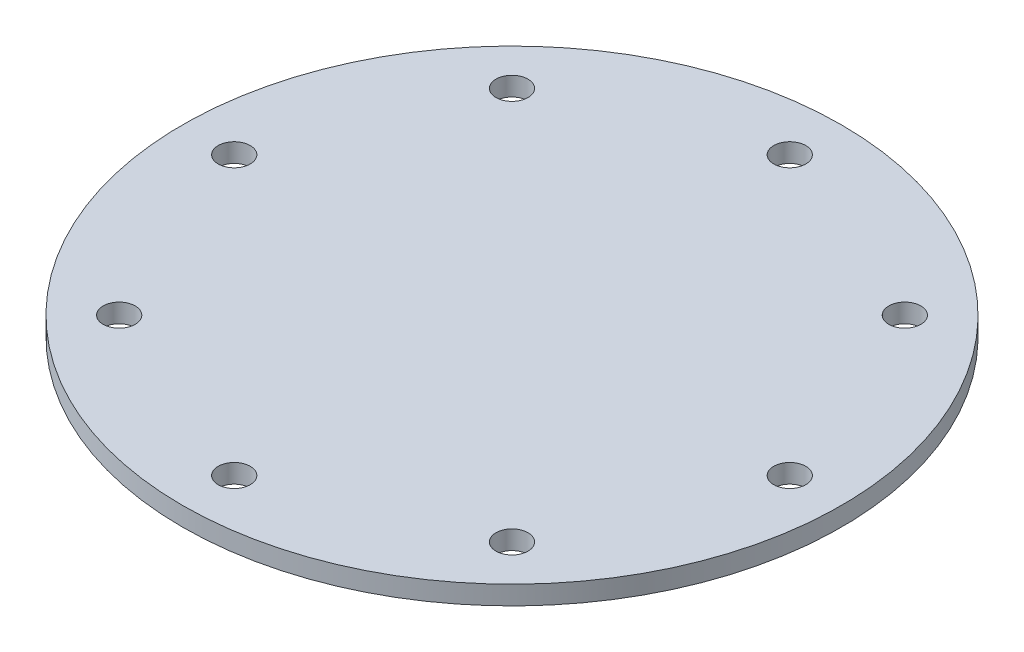
ISO-10303-21;
HEADER;
FILE_DESCRIPTION(('STEP AP214'),'2;1');
FILE_NAME('part.step','',(''),(''),'','','');
FILE_SCHEMA(('AUTOMOTIVE_DESIGN { 1 0 10303 214 1 1 1 1 }'));
ENDSEC;
DATA;
#1=APPLICATION_CONTEXT('core data for automotive mechanical design processes');
#2=APPLICATION_PROTOCOL_DEFINITION('international standard','automotive_design',2000,#1);
#3=PRODUCT_CONTEXT('',#1,'mechanical');
#4=PRODUCT('Part','Part','',(#3));
#5=PRODUCT_RELATED_PRODUCT_CATEGORY('part','',(#4));
#6=PRODUCT_DEFINITION_FORMATION('','',#4);
#7=PRODUCT_DEFINITION_CONTEXT('part definition',#1,'design');
#8=PRODUCT_DEFINITION('design','',#6,#7);
#9=PRODUCT_DEFINITION_SHAPE('','',#8);
#10=(LENGTH_UNIT() NAMED_UNIT(*) SI_UNIT(.MILLI.,.METRE.));
#11=(NAMED_UNIT(*) PLANE_ANGLE_UNIT() SI_UNIT($,.RADIAN.));
#12=(NAMED_UNIT(*) SI_UNIT($,.STERADIAN.) SOLID_ANGLE_UNIT());
#13=UNCERTAINTY_MEASURE_WITH_UNIT(LENGTH_MEASURE(1.E-05),#10,'distance_accuracy_value','');
#14=(GEOMETRIC_REPRESENTATION_CONTEXT(3) GLOBAL_UNCERTAINTY_ASSIGNED_CONTEXT((#13)) GLOBAL_UNIT_ASSIGNED_CONTEXT((#10,
#11,#12)) REPRESENTATION_CONTEXT('',''));
#15=CARTESIAN_POINT('',(0.,0.,0.));
#16=DIRECTION('',(0.,0.,1.));
#17=DIRECTION('',(1.,0.,0.));
#18=AXIS2_PLACEMENT_3D('',#15,#16,#17);
#19=CARTESIAN_POINT('',(0.,4.,0.));
#20=DIRECTION('',(0.,1.,0.));
#21=DIRECTION('',(0.,0.,1.));
#22=AXIS2_PLACEMENT_3D('',#19,#20,#21);
#23=PLANE('',#22);
#24=CARTESIAN_POINT('',(6.17992196975235E-13,4.,-59.));
#25=DIRECTION('',(0.,1.,0.));
#26=DIRECTION('',(0.,0.,1.));
#27=AXIS2_PLACEMENT_3D('',#24,#25,#26);
#28=CIRCLE('',#27,3.4);
#29=CARTESIAN_POINT('',(6.17992196975235E-13,4.,-55.6));
#30=VERTEX_POINT('',#29);
#31=EDGE_CURVE('E82',#30,#30,#28,.T.);
#32=ORIENTED_EDGE('',*,*,#31,.F.);
#33=EDGE_LOOP('',(#32));
#34=FACE_BOUND('',#33,.T.);
#35=CARTESIAN_POINT('',(-59.,4.,-4.1199479798349E-13));
#36=DIRECTION('',(0.,1.,0.));
#37=DIRECTION('',(0.,0.,1.));
#38=AXIS2_PLACEMENT_3D('',#35,#36,#37);
#39=CIRCLE('',#38,3.4);
#40=CARTESIAN_POINT('',(-59.,4.,3.39999999999959));
#41=VERTEX_POINT('',#40);
#42=EDGE_CURVE('E72',#41,#41,#39,.T.);
#43=ORIENTED_EDGE('',*,*,#42,.F.);
#44=EDGE_LOOP('',(#43));
#45=FACE_BOUND('',#44,.T.);
#46=CARTESIAN_POINT('',(-2.05997398991745E-13,4.,59.));
#47=DIRECTION('',(0.,1.,0.));
#48=DIRECTION('',(0.,0.,1.));
#49=AXIS2_PLACEMENT_3D('',#46,#47,#48);
#50=CIRCLE('',#49,3.4);
#51=CARTESIAN_POINT('',(-2.05997398991745E-13,4.,62.4));
#52=VERTEX_POINT('',#51);
#53=EDGE_CURVE('E64',#52,#52,#50,.T.);
#54=ORIENTED_EDGE('',*,*,#53,.F.);
#55=EDGE_LOOP('',(#54));
#56=FACE_BOUND('',#55,.T.);
#57=CARTESIAN_POINT('',(59.,4.,0.));
#58=DIRECTION('',(0.,1.,0.));
#59=DIRECTION('',(0.,0.,1.));
#60=AXIS2_PLACEMENT_3D('',#57,#58,#59);
#61=CIRCLE('',#60,3.4);
#62=CARTESIAN_POINT('',(59.,4.,3.4));
#63=VERTEX_POINT('',#62);
#64=EDGE_CURVE('E49',#63,#63,#61,.T.);
#65=ORIENTED_EDGE('',*,*,#64,.F.);
#66=EDGE_LOOP('',(#65));
#67=FACE_BOUND('',#66,.T.);
#68=CARTESIAN_POINT('',(0.,4.,0.));
#69=DIRECTION('',(0.,1.,0.));
#70=DIRECTION('',(0.,0.,1.));
#71=AXIS2_PLACEMENT_3D('',#68,#69,#70);
#72=CIRCLE('',#71,70.);
#73=CARTESIAN_POINT('',(0.,4.,70.));
#74=VERTEX_POINT('',#73);
#75=EDGE_CURVE('E10',#74,#74,#72,.T.);
#76=ORIENTED_EDGE('',*,*,#75,.T.);
#77=EDGE_LOOP('',(#76));
#78=FACE_BOUND('',#77,.T.);
#79=CARTESIAN_POINT('',(41.7193000900062,4.,41.7193000900064));
#80=DIRECTION('',(0.,1.,0.));
#81=DIRECTION('',(0.,0.,1.));
#82=AXIS2_PLACEMENT_3D('',#79,#80,#81);
#83=CIRCLE('',#82,3.4);
#84=CARTESIAN_POINT('',(41.7193000900062,4.,45.1193000900064));
#85=VERTEX_POINT('',#84);
#86=EDGE_CURVE('E54',#85,#85,#83,.T.);
#87=ORIENTED_EDGE('',*,*,#86,.F.);
#88=EDGE_LOOP('',(#87));
#89=FACE_BOUND('',#88,.T.);
#90=CARTESIAN_POINT('',(-41.7193000900065,4.,41.7193000900061));
#91=DIRECTION('',(0.,1.,0.));
#92=DIRECTION('',(0.,0.,1.));
#93=AXIS2_PLACEMENT_3D('',#90,#91,#92);
#94=CIRCLE('',#93,3.4);
#95=CARTESIAN_POINT('',(-41.7193000900065,4.,45.1193000900061));
#96=VERTEX_POINT('',#95);
#97=EDGE_CURVE('E70',#96,#96,#94,.T.);
#98=ORIENTED_EDGE('',*,*,#97,.F.);
#99=EDGE_LOOP('',(#98));
#100=FACE_BOUND('',#99,.T.);
#101=CARTESIAN_POINT('',(-41.719300090006,4.,-41.7193000900067));
#102=DIRECTION('',(0.,1.,0.));
#103=DIRECTION('',(0.,0.,1.));
#104=AXIS2_PLACEMENT_3D('',#101,#102,#103);
#105=CIRCLE('',#104,3.4);
#106=CARTESIAN_POINT('',(-41.719300090006,4.,-38.3193000900067));
#107=VERTEX_POINT('',#106);
#108=EDGE_CURVE('E79',#107,#107,#105,.T.);
#109=ORIENTED_EDGE('',*,*,#108,.F.);
#110=EDGE_LOOP('',(#109));
#111=FACE_BOUND('',#110,.T.);
#112=CARTESIAN_POINT('',(41.7193000900068,4.,-41.7193000900058));
#113=DIRECTION('',(0.,1.,0.));
#114=DIRECTION('',(0.,0.,1.));
#115=AXIS2_PLACEMENT_3D('',#112,#113,#114);
#116=CIRCLE('',#115,3.4);
#117=CARTESIAN_POINT('',(41.7193000900068,4.,-38.3193000900058));
#118=VERTEX_POINT('',#117);
#119=EDGE_CURVE('E93',#118,#118,#116,.T.);
#120=ORIENTED_EDGE('',*,*,#119,.F.);
#121=EDGE_LOOP('',(#120));
#122=FACE_BOUND('',#121,.T.);
#123=ADVANCED_FACE('F39',(#34,#45,#56,#67,#78,#89,#100,#111,#122),#23,.T.);
#124=CARTESIAN_POINT('',(0.,0.,0.));
#125=DIRECTION('',(0.,1.,0.));
#126=DIRECTION('',(0.,0.,1.));
#127=AXIS2_PLACEMENT_3D('',#124,#125,#126);
#128=PLANE('',#127);
#129=CARTESIAN_POINT('',(0.,0.,0.));
#130=DIRECTION('',(0.,1.,0.));
#131=DIRECTION('',(0.,0.,1.));
#132=AXIS2_PLACEMENT_3D('',#129,#130,#131);
#133=CIRCLE('',#132,70.);
#134=CARTESIAN_POINT('',(0.,0.,70.));
#135=VERTEX_POINT('',#134);
#136=EDGE_CURVE('E43',#135,#135,#133,.T.);
#137=ORIENTED_EDGE('',*,*,#136,.F.);
#138=EDGE_LOOP('',(#137));
#139=FACE_BOUND('',#138,.T.);
#140=CARTESIAN_POINT('',(59.,0.,0.));
#141=DIRECTION('',(0.,1.,0.));
#142=DIRECTION('',(0.,0.,1.));
#143=AXIS2_PLACEMENT_3D('',#140,#141,#142);
#144=CIRCLE('',#143,3.4);
#145=CARTESIAN_POINT('',(59.,0.,3.4));
#146=VERTEX_POINT('',#145);
#147=EDGE_CURVE('E55',#146,#146,#144,.T.);
#148=ORIENTED_EDGE('',*,*,#147,.T.);
#149=EDGE_LOOP('',(#148));
#150=FACE_BOUND('',#149,.T.);
#151=CARTESIAN_POINT('',(41.7193000900062,0.,41.7193000900064));
#152=DIRECTION('',(0.,1.,0.));
#153=DIRECTION('',(0.,0.,1.));
#154=AXIS2_PLACEMENT_3D('',#151,#152,#153);
#155=CIRCLE('',#154,3.4);
#156=CARTESIAN_POINT('',(41.7193000900062,0.,45.1193000900064));
#157=VERTEX_POINT('',#156);
#158=EDGE_CURVE('E59',#157,#157,#155,.T.);
#159=ORIENTED_EDGE('',*,*,#158,.T.);
#160=EDGE_LOOP('',(#159));
#161=FACE_BOUND('',#160,.T.);
#162=CARTESIAN_POINT('',(-2.05997398991745E-13,0.,59.));
#163=DIRECTION('',(0.,1.,0.));
#164=DIRECTION('',(0.,0.,1.));
#165=AXIS2_PLACEMENT_3D('',#162,#163,#164);
#166=CIRCLE('',#165,3.4);
#167=CARTESIAN_POINT('',(-2.05997398991745E-13,0.,62.4));
#168=VERTEX_POINT('',#167);
#169=EDGE_CURVE('E63',#168,#168,#166,.T.);
#170=ORIENTED_EDGE('',*,*,#169,.T.);
#171=EDGE_LOOP('',(#170));
#172=FACE_BOUND('',#171,.T.);
#173=CARTESIAN_POINT('',(-41.7193000900065,0.,41.7193000900061));
#174=DIRECTION('',(0.,1.,0.));
#175=DIRECTION('',(0.,0.,1.));
#176=AXIS2_PLACEMENT_3D('',#173,#174,#175);
#177=CIRCLE('',#176,3.4);
#178=CARTESIAN_POINT('',(-41.7193000900065,0.,45.1193000900061));
#179=VERTEX_POINT('',#178);
#180=EDGE_CURVE('E66',#179,#179,#177,.T.);
#181=ORIENTED_EDGE('',*,*,#180,.T.);
#182=EDGE_LOOP('',(#181));
#183=FACE_BOUND('',#182,.T.);
#184=CARTESIAN_POINT('',(-59.,0.,-4.1199479798349E-13));
#185=DIRECTION('',(0.,1.,0.));
#186=DIRECTION('',(0.,0.,1.));
#187=AXIS2_PLACEMENT_3D('',#184,#185,#186);
#188=CIRCLE('',#187,3.4);
#189=CARTESIAN_POINT('',(-59.,0.,3.39999999999959));
#190=VERTEX_POINT('',#189);
#191=EDGE_CURVE('E77',#190,#190,#188,.T.);
#192=ORIENTED_EDGE('',*,*,#191,.T.);
#193=EDGE_LOOP('',(#192));
#194=FACE_BOUND('',#193,.T.);
#195=CARTESIAN_POINT('',(-41.719300090006,0.,-41.7193000900067));
#196=DIRECTION('',(0.,1.,0.));
#197=DIRECTION('',(0.,0.,1.));
#198=AXIS2_PLACEMENT_3D('',#195,#196,#197);
#199=CIRCLE('',#198,3.4);
#200=CARTESIAN_POINT('',(-41.719300090006,0.,-38.3193000900067));
#201=VERTEX_POINT('',#200);
#202=EDGE_CURVE('E81',#201,#201,#199,.T.);
#203=ORIENTED_EDGE('',*,*,#202,.T.);
#204=EDGE_LOOP('',(#203));
#205=FACE_BOUND('',#204,.T.);
#206=CARTESIAN_POINT('',(6.17992196975235E-13,0.,-59.));
#207=DIRECTION('',(0.,1.,0.));
#208=DIRECTION('',(0.,0.,1.));
#209=AXIS2_PLACEMENT_3D('',#206,#207,#208);
#210=CIRCLE('',#209,3.4);
#211=CARTESIAN_POINT('',(6.17992196975235E-13,0.,-55.6));
#212=VERTEX_POINT('',#211);
#213=EDGE_CURVE('E88',#212,#212,#210,.T.);
#214=ORIENTED_EDGE('',*,*,#213,.T.);
#215=EDGE_LOOP('',(#214));
#216=FACE_BOUND('',#215,.T.);
#217=CARTESIAN_POINT('',(41.7193000900068,0.,-41.7193000900058));
#218=DIRECTION('',(0.,1.,0.));
#219=DIRECTION('',(0.,0.,1.));
#220=AXIS2_PLACEMENT_3D('',#217,#218,#219);
#221=CIRCLE('',#220,3.4);
#222=CARTESIAN_POINT('',(41.7193000900068,0.,-38.3193000900058));
#223=VERTEX_POINT('',#222);
#224=EDGE_CURVE('E95',#223,#223,#221,.T.);
#225=ORIENTED_EDGE('',*,*,#224,.T.);
#226=EDGE_LOOP('',(#225));
#227=FACE_BOUND('',#226,.T.);
#228=ADVANCED_FACE('F104',(#139,#150,#161,#172,#183,#194,#205,#216,#227),#128,.F.);
#229=CARTESIAN_POINT('',(0.,4.,0.));
#230=DIRECTION('',(0.,-1.,0.));
#231=DIRECTION('',(0.,0.,-1.));
#232=AXIS2_PLACEMENT_3D('',#229,#230,#231);
#233=CYLINDRICAL_SURFACE('',#232,70.);
#234=ORIENTED_EDGE('',*,*,#75,.F.);
#235=EDGE_LOOP('',(#234));
#236=FACE_BOUND('',#235,.T.);
#237=ORIENTED_EDGE('',*,*,#136,.T.);
#238=EDGE_LOOP('',(#237));
#239=FACE_BOUND('',#238,.T.);
#240=ADVANCED_FACE('F41',(#236,#239),#233,.T.);
#241=CARTESIAN_POINT('',(59.,4.,0.));
#242=DIRECTION('',(0.,-1.,0.));
#243=DIRECTION('',(0.,0.,-1.));
#244=AXIS2_PLACEMENT_3D('',#241,#242,#243);
#245=CYLINDRICAL_SURFACE('',#244,3.4);
#246=ORIENTED_EDGE('',*,*,#64,.T.);
#247=EDGE_LOOP('',(#246));
#248=FACE_BOUND('',#247,.T.);
#249=ORIENTED_EDGE('',*,*,#147,.F.);
#250=EDGE_LOOP('',(#249));
#251=FACE_BOUND('',#250,.T.);
#252=ADVANCED_FACE('F112',(#248,#251),#245,.F.);
#253=CARTESIAN_POINT('',(41.7193000900062,4.,41.7193000900064));
#254=DIRECTION('',(0.,-1.,0.));
#255=DIRECTION('',(0.,0.,-1.));
#256=AXIS2_PLACEMENT_3D('',#253,#254,#255);
#257=CYLINDRICAL_SURFACE('',#256,3.4);
#258=ORIENTED_EDGE('',*,*,#86,.T.);
#259=EDGE_LOOP('',(#258));
#260=FACE_BOUND('',#259,.T.);
#261=ORIENTED_EDGE('',*,*,#158,.F.);
#262=EDGE_LOOP('',(#261));
#263=FACE_BOUND('',#262,.T.);
#264=ADVANCED_FACE('F120',(#260,#263),#257,.F.);
#265=CARTESIAN_POINT('',(-2.05997398991745E-13,4.,59.));
#266=DIRECTION('',(0.,-1.,0.));
#267=DIRECTION('',(0.,0.,-1.));
#268=AXIS2_PLACEMENT_3D('',#265,#266,#267);
#269=CYLINDRICAL_SURFACE('',#268,3.4);
#270=ORIENTED_EDGE('',*,*,#53,.T.);
#271=EDGE_LOOP('',(#270));
#272=FACE_BOUND('',#271,.T.);
#273=ORIENTED_EDGE('',*,*,#169,.F.);
#274=EDGE_LOOP('',(#273));
#275=FACE_BOUND('',#274,.T.);
#276=ADVANCED_FACE('F122',(#272,#275),#269,.F.);
#277=CARTESIAN_POINT('',(-41.7193000900065,4.,41.7193000900061));
#278=DIRECTION('',(0.,-1.,0.));
#279=DIRECTION('',(0.,0.,-1.));
#280=AXIS2_PLACEMENT_3D('',#277,#278,#279);
#281=CYLINDRICAL_SURFACE('',#280,3.4);
#282=ORIENTED_EDGE('',*,*,#97,.T.);
#283=EDGE_LOOP('',(#282));
#284=FACE_BOUND('',#283,.T.);
#285=ORIENTED_EDGE('',*,*,#180,.F.);
#286=EDGE_LOOP('',(#285));
#287=FACE_BOUND('',#286,.T.);
#288=ADVANCED_FACE('F123',(#284,#287),#281,.F.);
#289=CARTESIAN_POINT('',(-59.,4.,-4.1199479798349E-13));
#290=DIRECTION('',(0.,-1.,0.));
#291=DIRECTION('',(0.,0.,-1.));
#292=AXIS2_PLACEMENT_3D('',#289,#290,#291);
#293=CYLINDRICAL_SURFACE('',#292,3.4);
#294=ORIENTED_EDGE('',*,*,#42,.T.);
#295=EDGE_LOOP('',(#294));
#296=FACE_BOUND('',#295,.T.);
#297=ORIENTED_EDGE('',*,*,#191,.F.);
#298=EDGE_LOOP('',(#297));
#299=FACE_BOUND('',#298,.T.);
#300=ADVANCED_FACE('F128',(#296,#299),#293,.F.);
#301=CARTESIAN_POINT('',(-41.719300090006,4.,-41.7193000900067));
#302=DIRECTION('',(0.,-1.,0.));
#303=DIRECTION('',(0.,0.,-1.));
#304=AXIS2_PLACEMENT_3D('',#301,#302,#303);
#305=CYLINDRICAL_SURFACE('',#304,3.4);
#306=ORIENTED_EDGE('',*,*,#108,.T.);
#307=EDGE_LOOP('',(#306));
#308=FACE_BOUND('',#307,.T.);
#309=ORIENTED_EDGE('',*,*,#202,.F.);
#310=EDGE_LOOP('',(#309));
#311=FACE_BOUND('',#310,.T.);
#312=ADVANCED_FACE('F133',(#308,#311),#305,.F.);
#313=CARTESIAN_POINT('',(6.17992196975235E-13,4.,-59.));
#314=DIRECTION('',(0.,-1.,0.));
#315=DIRECTION('',(0.,0.,-1.));
#316=AXIS2_PLACEMENT_3D('',#313,#314,#315);
#317=CYLINDRICAL_SURFACE('',#316,3.4);
#318=ORIENTED_EDGE('',*,*,#31,.T.);
#319=EDGE_LOOP('',(#318));
#320=FACE_BOUND('',#319,.T.);
#321=ORIENTED_EDGE('',*,*,#213,.F.);
#322=EDGE_LOOP('',(#321));
#323=FACE_BOUND('',#322,.T.);
#324=ADVANCED_FACE('F139',(#320,#323),#317,.F.);
#325=CARTESIAN_POINT('',(41.7193000900068,4.,-41.7193000900058));
#326=DIRECTION('',(0.,-1.,0.));
#327=DIRECTION('',(0.,0.,-1.));
#328=AXIS2_PLACEMENT_3D('',#325,#326,#327);
#329=CYLINDRICAL_SURFACE('',#328,3.4);
#330=ORIENTED_EDGE('',*,*,#119,.T.);
#331=EDGE_LOOP('',(#330));
#332=FACE_BOUND('',#331,.T.);
#333=ORIENTED_EDGE('',*,*,#224,.F.);
#334=EDGE_LOOP('',(#333));
#335=FACE_BOUND('',#334,.T.);
#336=ADVANCED_FACE('F99',(#332,#335),#329,.F.);
#337=CLOSED_SHELL('',(#123,#228,#240,#252,#264,#276,#288,#300,#312,#324,#336));
#338=MANIFOLD_SOLID_BREP('B2',#337);
#339=ADVANCED_BREP_SHAPE_REPRESENTATION('',(#18,#338),#14);
#340=SHAPE_DEFINITION_REPRESENTATION(#9,#339);
ENDSEC;
END-ISO-10303-21;
